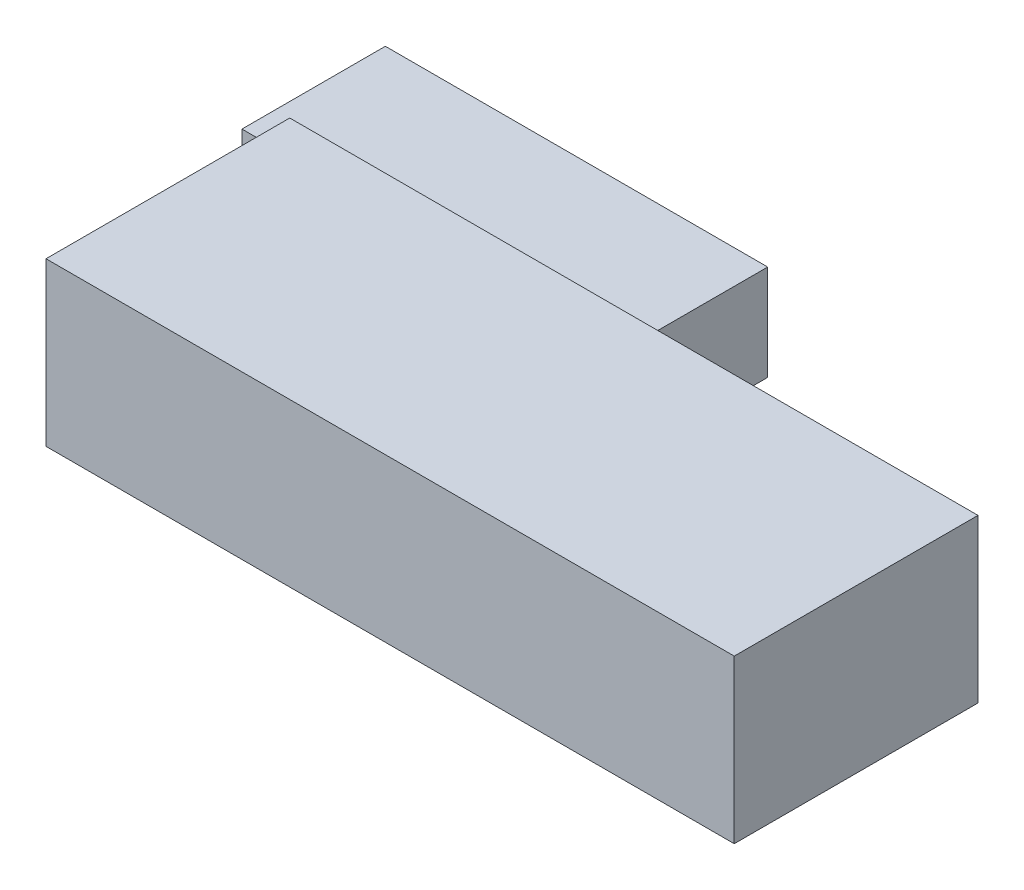
ISO-10303-21;
HEADER;
FILE_DESCRIPTION(('STEP AP214'),'2;1');
FILE_NAME('part.step','',(''),(''),'','','');
FILE_SCHEMA(('AUTOMOTIVE_DESIGN { 1 0 10303 214 1 1 1 1 }'));
ENDSEC;
DATA;
#1=APPLICATION_CONTEXT('core data for automotive mechanical design processes');
#2=APPLICATION_PROTOCOL_DEFINITION('international standard','automotive_design',2000,#1);
#3=PRODUCT_CONTEXT('',#1,'mechanical');
#4=PRODUCT('Part','Part','',(#3));
#5=PRODUCT_RELATED_PRODUCT_CATEGORY('part','',(#4));
#6=PRODUCT_DEFINITION_FORMATION('','',#4);
#7=PRODUCT_DEFINITION_CONTEXT('part definition',#1,'design');
#8=PRODUCT_DEFINITION('design','',#6,#7);
#9=PRODUCT_DEFINITION_SHAPE('','',#8);
#10=(LENGTH_UNIT() NAMED_UNIT(*) SI_UNIT(.MILLI.,.METRE.));
#11=(NAMED_UNIT(*) PLANE_ANGLE_UNIT() SI_UNIT($,.RADIAN.));
#12=(NAMED_UNIT(*) SI_UNIT($,.STERADIAN.) SOLID_ANGLE_UNIT());
#13=UNCERTAINTY_MEASURE_WITH_UNIT(LENGTH_MEASURE(1.E-05),#10,'distance_accuracy_value','');
#14=(GEOMETRIC_REPRESENTATION_CONTEXT(3) GLOBAL_UNCERTAINTY_ASSIGNED_CONTEXT((#13)) GLOBAL_UNIT_ASSIGNED_CONTEXT((#10,
#11,#12)) REPRESENTATION_CONTEXT('',''));
#15=CARTESIAN_POINT('',(0.,0.,0.));
#16=DIRECTION('',(0.,0.,1.));
#17=DIRECTION('',(1.,0.,0.));
#18=AXIS2_PLACEMENT_3D('',#15,#16,#17);
#19=CARTESIAN_POINT('',(-72.,34.,-25.5));
#20=DIRECTION('',(0.,0.,1.));
#21=DIRECTION('',(1.,0.,0.));
#22=AXIS2_PLACEMENT_3D('',#19,#20,#21);
#23=PLANE('',#22);
#24=DIRECTION('',(-1.,0.,0.));
#25=VECTOR('',#24,1.);
#26=CARTESIAN_POINT('',(-1.99999999999997,7.00000000000001,-25.5));
#27=LINE('',#26,#25);
#28=CARTESIAN_POINT('',(-1.99999999999997,7.00000000000001,-25.5));
#29=VERTEX_POINT('',#28);
#30=CARTESIAN_POINT('',(-72.,7.00000000000001,-25.5));
#31=VERTEX_POINT('',#30);
#32=EDGE_CURVE('E50',#29,#31,#27,.T.);
#33=ORIENTED_EDGE('',*,*,#32,.F.);
#34=DIRECTION('',(0.,-1.,0.));
#35=VECTOR('',#34,1.);
#36=CARTESIAN_POINT('',(-1.99999999999997,7.00000000000001,-25.5));
#37=LINE('',#36,#35);
#38=CARTESIAN_POINT('',(-1.99999999999997,27.,-25.5));
#39=VERTEX_POINT('',#38);
#40=EDGE_CURVE('E183',#39,#29,#37,.T.);
#41=ORIENTED_EDGE('',*,*,#40,.F.);
#42=DIRECTION('',(1.,0.,0.));
#43=VECTOR('',#42,1.);
#44=CARTESIAN_POINT('',(-1.99999999999997,27.,-25.5));
#45=LINE('',#44,#43);
#46=CARTESIAN_POINT('',(-72.,27.,-25.5));
#47=VERTEX_POINT('',#46);
#48=EDGE_CURVE('E11',#47,#39,#45,.T.);
#49=ORIENTED_EDGE('',*,*,#48,.F.);
#50=DIRECTION('',(0.,-1.,0.));
#51=VECTOR('',#50,1.);
#52=CARTESIAN_POINT('',(-72.,34.,-25.5));
#53=LINE('',#52,#51);
#54=CARTESIAN_POINT('',(-72.,34.,-25.5));
#55=VERTEX_POINT('',#54);
#56=EDGE_CURVE('E158',#55,#47,#53,.T.);
#57=ORIENTED_EDGE('',*,*,#56,.F.);
#58=DIRECTION('',(-1.,0.,0.));
#59=VECTOR('',#58,1.);
#60=CARTESIAN_POINT('',(-72.,34.,-25.5));
#61=LINE('',#60,#59);
#62=CARTESIAN_POINT('',(72.,34.,-25.5));
#63=VERTEX_POINT('',#62);
#64=EDGE_CURVE('E142',#63,#55,#61,.T.);
#65=ORIENTED_EDGE('',*,*,#64,.F.);
#66=DIRECTION('',(0.,-1.,0.));
#67=VECTOR('',#66,1.);
#68=CARTESIAN_POINT('',(72.,34.,-25.5));
#69=LINE('',#68,#67);
#70=CARTESIAN_POINT('',(72.,0.,-25.5));
#71=VERTEX_POINT('',#70);
#72=EDGE_CURVE('E37',#63,#71,#69,.T.);
#73=ORIENTED_EDGE('',*,*,#72,.T.);
#74=DIRECTION('',(-1.,0.,0.));
#75=VECTOR('',#74,1.);
#76=CARTESIAN_POINT('',(-72.,0.,-25.5));
#77=LINE('',#76,#75);
#78=CARTESIAN_POINT('',(-72.,0.,-25.5));
#79=VERTEX_POINT('',#78);
#80=EDGE_CURVE('E133',#71,#79,#77,.T.);
#81=ORIENTED_EDGE('',*,*,#80,.T.);
#82=EDGE_CURVE('E55',#31,#79,#53,.T.);
#83=ORIENTED_EDGE('',*,*,#82,.F.);
#84=EDGE_LOOP('',(#33,#41,#49,#57,#65,#73,#81,#83));
#85=FACE_BOUND('',#84,.T.);
#86=ADVANCED_FACE('F33',(#85),#23,.F.);
#87=CARTESIAN_POINT('',(72.,34.,25.5));
#88=DIRECTION('',(-1.,0.,0.));
#89=DIRECTION('',(0.,0.,1.));
#90=AXIS2_PLACEMENT_3D('',#87,#88,#89);
#91=PLANE('',#90);
#92=DIRECTION('',(0.,0.,-1.));
#93=VECTOR('',#92,1.);
#94=CARTESIAN_POINT('',(72.,0.,25.5));
#95=LINE('',#94,#93);
#96=CARTESIAN_POINT('',(72.,0.,25.5));
#97=VERTEX_POINT('',#96);
#98=EDGE_CURVE('E130',#97,#71,#95,.T.);
#99=ORIENTED_EDGE('',*,*,#98,.T.);
#100=ORIENTED_EDGE('',*,*,#72,.F.);
#101=DIRECTION('',(0.,0.,-1.));
#102=VECTOR('',#101,1.);
#103=CARTESIAN_POINT('',(72.,34.,25.5));
#104=LINE('',#103,#102);
#105=CARTESIAN_POINT('',(72.,34.,25.5));
#106=VERTEX_POINT('',#105);
#107=EDGE_CURVE('E139',#106,#63,#104,.T.);
#108=ORIENTED_EDGE('',*,*,#107,.F.);
#109=DIRECTION('',(0.,-1.,0.));
#110=VECTOR('',#109,1.);
#111=CARTESIAN_POINT('',(72.,34.,25.5));
#112=LINE('',#111,#110);
#113=EDGE_CURVE('E148',#106,#97,#112,.T.);
#114=ORIENTED_EDGE('',*,*,#113,.T.);
#115=EDGE_LOOP('',(#99,#100,#108,#114));
#116=FACE_BOUND('',#115,.T.);
#117=ADVANCED_FACE('F35',(#116),#91,.F.);
#118=CARTESIAN_POINT('',(-72.,34.,25.5));
#119=DIRECTION('',(1.,0.,0.));
#120=DIRECTION('',(0.,0.,-1.));
#121=AXIS2_PLACEMENT_3D('',#118,#119,#120);
#122=PLANE('',#121);
#123=DIRECTION('',(0.,0.,1.));
#124=VECTOR('',#123,1.);
#125=CARTESIAN_POINT('',(-72.,0.,25.5));
#126=LINE('',#125,#124);
#127=CARTESIAN_POINT('',(-72.,0.,25.5));
#128=VERTEX_POINT('',#127);
#129=EDGE_CURVE('E151',#79,#128,#126,.T.);
#130=ORIENTED_EDGE('',*,*,#129,.T.);
#131=DIRECTION('',(0.,-1.,0.));
#132=VECTOR('',#131,1.);
#133=CARTESIAN_POINT('',(-72.,34.,25.5));
#134=LINE('',#133,#132);
#135=CARTESIAN_POINT('',(-72.,34.,25.5));
#136=VERTEX_POINT('',#135);
#137=EDGE_CURVE('E156',#136,#128,#134,.T.);
#138=ORIENTED_EDGE('',*,*,#137,.F.);
#139=DIRECTION('',(0.,0.,1.));
#140=VECTOR('',#139,1.);
#141=CARTESIAN_POINT('',(-72.,34.,25.5));
#142=LINE('',#141,#140);
#143=EDGE_CURVE('E145',#55,#136,#142,.T.);
#144=ORIENTED_EDGE('',*,*,#143,.F.);
#145=ORIENTED_EDGE('',*,*,#56,.T.);
#146=EDGE_CURVE('E160',#47,#31,#53,.T.);
#147=ORIENTED_EDGE('',*,*,#146,.T.);
#148=ORIENTED_EDGE('',*,*,#82,.T.);
#149=EDGE_LOOP('',(#130,#138,#144,#145,#147,#148));
#150=FACE_BOUND('',#149,.T.);
#151=ADVANCED_FACE('F166',(#150),#122,.F.);
#152=CARTESIAN_POINT('',(-72.,34.,25.5));
#153=DIRECTION('',(0.,0.,-1.));
#154=DIRECTION('',(-1.,0.,0.));
#155=AXIS2_PLACEMENT_3D('',#152,#153,#154);
#156=PLANE('',#155);
#157=DIRECTION('',(1.,0.,0.));
#158=VECTOR('',#157,1.);
#159=CARTESIAN_POINT('',(-72.,0.,25.5));
#160=LINE('',#159,#158);
#161=EDGE_CURVE('E143',#128,#97,#160,.T.);
#162=ORIENTED_EDGE('',*,*,#161,.T.);
#163=ORIENTED_EDGE('',*,*,#113,.F.);
#164=DIRECTION('',(1.,0.,0.));
#165=VECTOR('',#164,1.);
#166=CARTESIAN_POINT('',(-72.,34.,25.5));
#167=LINE('',#166,#165);
#168=EDGE_CURVE('E147',#136,#106,#167,.T.);
#169=ORIENTED_EDGE('',*,*,#168,.F.);
#170=ORIENTED_EDGE('',*,*,#137,.T.);
#171=EDGE_LOOP('',(#162,#163,#169,#170));
#172=FACE_BOUND('',#171,.T.);
#173=ADVANCED_FACE('F177',(#172),#156,.F.);
#174=CARTESIAN_POINT('',(0.,34.,0.));
#175=DIRECTION('',(0.,-1.,0.));
#176=DIRECTION('',(0.,0.,-1.));
#177=AXIS2_PLACEMENT_3D('',#174,#175,#176);
#178=PLANE('',#177);
#179=ORIENTED_EDGE('',*,*,#107,.T.);
#180=ORIENTED_EDGE('',*,*,#64,.T.);
#181=ORIENTED_EDGE('',*,*,#143,.T.);
#182=ORIENTED_EDGE('',*,*,#168,.T.);
#183=EDGE_LOOP('',(#179,#180,#181,#182));
#184=FACE_BOUND('',#183,.T.);
#185=ADVANCED_FACE('F182',(#184),#178,.F.);
#186=CARTESIAN_POINT('',(0.,0.,0.));
#187=DIRECTION('',(0.,-1.,0.));
#188=DIRECTION('',(0.,0.,-1.));
#189=AXIS2_PLACEMENT_3D('',#186,#187,#188);
#190=PLANE('',#189);
#191=ORIENTED_EDGE('',*,*,#98,.F.);
#192=ORIENTED_EDGE('',*,*,#161,.F.);
#193=ORIENTED_EDGE('',*,*,#129,.F.);
#194=ORIENTED_EDGE('',*,*,#80,.F.);
#195=EDGE_LOOP('',(#191,#192,#193,#194));
#196=FACE_BOUND('',#195,.T.);
#197=ADVANCED_FACE('F174',(#196),#190,.T.);
#198=CARTESIAN_POINT('',(0.,0.,-25.5));
#199=DIRECTION('',(0.,0.,1.));
#200=DIRECTION('',(1.,0.,0.));
#201=AXIS2_PLACEMENT_3D('',#198,#199,#200);
#202=PLANE('',#201);
#203=ORIENTED_EDGE('',*,*,#146,.F.);
#204=CARTESIAN_POINT('',(-82.,27.,-25.5));
#205=VERTEX_POINT('',#204);
#206=EDGE_CURVE('E43',#205,#47,#45,.T.);
#207=ORIENTED_EDGE('',*,*,#206,.F.);
#208=DIRECTION('',(0.,1.,0.));
#209=VECTOR('',#208,1.);
#210=CARTESIAN_POINT('',(-82.,7.00000000000001,-25.5));
#211=LINE('',#210,#209);
#212=CARTESIAN_POINT('',(-82.,7.00000000000001,-25.5));
#213=VERTEX_POINT('',#212);
#214=EDGE_CURVE('E129',#213,#205,#211,.T.);
#215=ORIENTED_EDGE('',*,*,#214,.F.);
#216=EDGE_CURVE('E194',#31,#213,#27,.T.);
#217=ORIENTED_EDGE('',*,*,#216,.F.);
#218=EDGE_LOOP('',(#203,#207,#215,#217));
#219=FACE_BOUND('',#218,.T.);
#220=ADVANCED_FACE('F199',(#219),#202,.T.);
#221=CARTESIAN_POINT('',(-82.,7.00000000000001,-55.5));
#222=DIRECTION('',(1.,0.,0.));
#223=DIRECTION('',(0.,0.,-1.));
#224=AXIS2_PLACEMENT_3D('',#221,#222,#223);
#225=PLANE('',#224);
#226=ORIENTED_EDGE('',*,*,#214,.T.);
#227=DIRECTION('',(0.,0.,1.));
#228=VECTOR('',#227,1.);
#229=CARTESIAN_POINT('',(-82.,27.,-55.5));
#230=LINE('',#229,#228);
#231=CARTESIAN_POINT('',(-82.,27.,-55.5));
#232=VERTEX_POINT('',#231);
#233=EDGE_CURVE('E110',#232,#205,#230,.T.);
#234=ORIENTED_EDGE('',*,*,#233,.F.);
#235=DIRECTION('',(0.,1.,0.));
#236=VECTOR('',#235,1.);
#237=CARTESIAN_POINT('',(-82.,7.00000000000001,-55.5));
#238=LINE('',#237,#236);
#239=CARTESIAN_POINT('',(-82.,7.00000000000001,-55.5));
#240=VERTEX_POINT('',#239);
#241=EDGE_CURVE('E117',#240,#232,#238,.T.);
#242=ORIENTED_EDGE('',*,*,#241,.F.);
#243=DIRECTION('',(0.,0.,1.));
#244=VECTOR('',#243,1.);
#245=CARTESIAN_POINT('',(-82.,7.00000000000001,-55.5));
#246=LINE('',#245,#244);
#247=EDGE_CURVE('E189',#240,#213,#246,.T.);
#248=ORIENTED_EDGE('',*,*,#247,.T.);
#249=EDGE_LOOP('',(#226,#234,#242,#248));
#250=FACE_BOUND('',#249,.T.);
#251=ADVANCED_FACE('F127',(#250),#225,.F.);
#252=CARTESIAN_POINT('',(-1.99999999999997,27.,-55.5));
#253=DIRECTION('',(0.,-1.,0.));
#254=DIRECTION('',(0.,0.,-1.));
#255=AXIS2_PLACEMENT_3D('',#252,#253,#254);
#256=PLANE('',#255);
#257=ORIENTED_EDGE('',*,*,#206,.T.);
#258=ORIENTED_EDGE('',*,*,#48,.T.);
#259=DIRECTION('',(0.,0.,1.));
#260=VECTOR('',#259,1.);
#261=CARTESIAN_POINT('',(-1.99999999999997,27.,-55.5));
#262=LINE('',#261,#260);
#263=CARTESIAN_POINT('',(-1.99999999999997,27.,-55.5));
#264=VERTEX_POINT('',#263);
#265=EDGE_CURVE('E113',#264,#39,#262,.T.);
#266=ORIENTED_EDGE('',*,*,#265,.F.);
#267=DIRECTION('',(1.,0.,0.));
#268=VECTOR('',#267,1.);
#269=CARTESIAN_POINT('',(-1.99999999999997,27.,-55.5));
#270=LINE('',#269,#268);
#271=EDGE_CURVE('E105',#232,#264,#270,.T.);
#272=ORIENTED_EDGE('',*,*,#271,.F.);
#273=ORIENTED_EDGE('',*,*,#233,.T.);
#274=EDGE_LOOP('',(#257,#258,#266,#272,#273));
#275=FACE_BOUND('',#274,.T.);
#276=ADVANCED_FACE('F108',(#275),#256,.F.);
#277=CARTESIAN_POINT('',(-1.99999999999997,7.00000000000001,-55.5));
#278=DIRECTION('',(-1.,0.,0.));
#279=DIRECTION('',(0.,0.,1.));
#280=AXIS2_PLACEMENT_3D('',#277,#278,#279);
#281=PLANE('',#280);
#282=ORIENTED_EDGE('',*,*,#40,.T.);
#283=DIRECTION('',(0.,0.,1.));
#284=VECTOR('',#283,1.);
#285=CARTESIAN_POINT('',(-1.99999999999997,7.00000000000001,-55.5));
#286=LINE('',#285,#284);
#287=CARTESIAN_POINT('',(-1.99999999999997,7.00000000000001,-55.5));
#288=VERTEX_POINT('',#287);
#289=EDGE_CURVE('E135',#288,#29,#286,.T.);
#290=ORIENTED_EDGE('',*,*,#289,.F.);
#291=DIRECTION('',(0.,-1.,0.));
#292=VECTOR('',#291,1.);
#293=CARTESIAN_POINT('',(-1.99999999999997,7.00000000000001,-55.5));
#294=LINE('',#293,#292);
#295=EDGE_CURVE('E116',#264,#288,#294,.T.);
#296=ORIENTED_EDGE('',*,*,#295,.F.);
#297=ORIENTED_EDGE('',*,*,#265,.T.);
#298=EDGE_LOOP('',(#282,#290,#296,#297));
#299=FACE_BOUND('',#298,.T.);
#300=ADVANCED_FACE('F185',(#299),#281,.F.);
#301=CARTESIAN_POINT('',(-1.99999999999997,7.00000000000001,-55.5));
#302=DIRECTION('',(0.,1.,0.));
#303=DIRECTION('',(0.,0.,1.));
#304=AXIS2_PLACEMENT_3D('',#301,#302,#303);
#305=PLANE('',#304);
#306=ORIENTED_EDGE('',*,*,#32,.T.);
#307=ORIENTED_EDGE('',*,*,#216,.T.);
#308=ORIENTED_EDGE('',*,*,#247,.F.);
#309=DIRECTION('',(-1.,0.,0.));
#310=VECTOR('',#309,1.);
#311=CARTESIAN_POINT('',(-1.99999999999997,7.00000000000001,-55.5));
#312=LINE('',#311,#310);
#313=EDGE_CURVE('E122',#288,#240,#312,.T.);
#314=ORIENTED_EDGE('',*,*,#313,.F.);
#315=ORIENTED_EDGE('',*,*,#289,.T.);
#316=EDGE_LOOP('',(#306,#307,#308,#314,#315));
#317=FACE_BOUND('',#316,.T.);
#318=ADVANCED_FACE('F197',(#317),#305,.F.);
#319=CARTESIAN_POINT('',(0.,0.,-55.5));
#320=DIRECTION('',(0.,0.,1.));
#321=DIRECTION('',(1.,0.,0.));
#322=AXIS2_PLACEMENT_3D('',#319,#320,#321);
#323=PLANE('',#322);
#324=ORIENTED_EDGE('',*,*,#241,.T.);
#325=ORIENTED_EDGE('',*,*,#271,.T.);
#326=ORIENTED_EDGE('',*,*,#295,.T.);
#327=ORIENTED_EDGE('',*,*,#313,.T.);
#328=EDGE_LOOP('',(#324,#325,#326,#327));
#329=FACE_BOUND('',#328,.T.);
#330=ADVANCED_FACE('F120',(#329),#323,.F.);
#331=CLOSED_SHELL('',(#86,#117,#151,#173,#185,#197,#220,#251,#276,#300,#318,#330));
#332=MANIFOLD_SOLID_BREP('B2',#331);
#333=ADVANCED_BREP_SHAPE_REPRESENTATION('',(#18,#332),#14);
#334=SHAPE_DEFINITION_REPRESENTATION(#9,#333);
ENDSEC;
END-ISO-10303-21;
